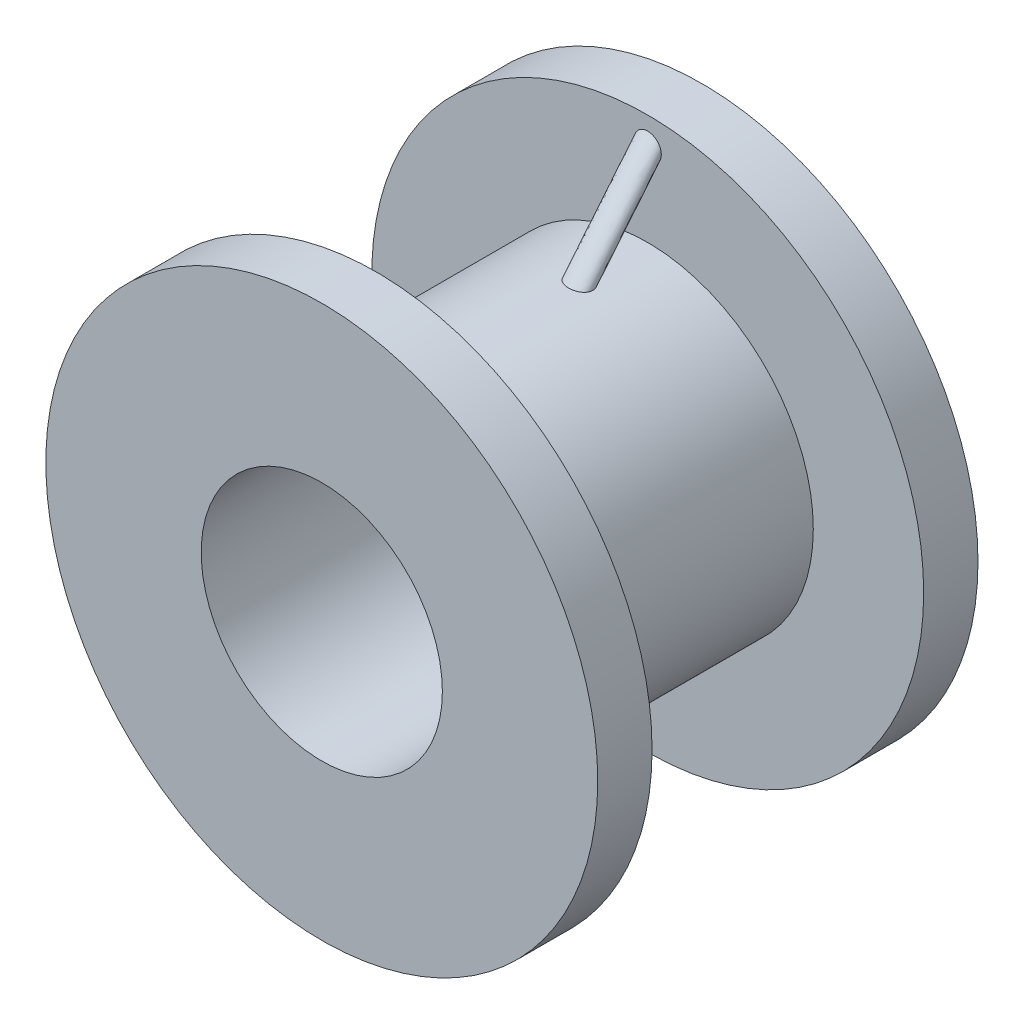
ISO-10303-21;
HEADER;
FILE_DESCRIPTION(('STEP AP214'),'2;1');
FILE_NAME('part.step','',(''),(''),'','','');
FILE_SCHEMA(('AUTOMOTIVE_DESIGN { 1 0 10303 214 1 1 1 1 }'));
ENDSEC;
DATA;
#1=APPLICATION_CONTEXT('core data for automotive mechanical design processes');
#2=APPLICATION_PROTOCOL_DEFINITION('international standard','automotive_design',2000,#1);
#3=PRODUCT_CONTEXT('',#1,'mechanical');
#4=PRODUCT('Part','Part','',(#3));
#5=PRODUCT_RELATED_PRODUCT_CATEGORY('part','',(#4));
#6=PRODUCT_DEFINITION_FORMATION('','',#4);
#7=PRODUCT_DEFINITION_CONTEXT('part definition',#1,'design');
#8=PRODUCT_DEFINITION('design','',#6,#7);
#9=PRODUCT_DEFINITION_SHAPE('','',#8);
#10=(LENGTH_UNIT() NAMED_UNIT(*) SI_UNIT(.MILLI.,.METRE.));
#11=(NAMED_UNIT(*) PLANE_ANGLE_UNIT() SI_UNIT($,.RADIAN.));
#12=(NAMED_UNIT(*) SI_UNIT($,.STERADIAN.) SOLID_ANGLE_UNIT());
#13=UNCERTAINTY_MEASURE_WITH_UNIT(LENGTH_MEASURE(1.E-05),#10,'distance_accuracy_value','');
#14=(GEOMETRIC_REPRESENTATION_CONTEXT(3) GLOBAL_UNCERTAINTY_ASSIGNED_CONTEXT((#13)) GLOBAL_UNIT_ASSIGNED_CONTEXT((#10,
#11,#12)) REPRESENTATION_CONTEXT('',''));
#15=CARTESIAN_POINT('',(0.,0.,0.));
#16=DIRECTION('',(0.,0.,1.));
#17=DIRECTION('',(1.,0.,0.));
#18=AXIS2_PLACEMENT_3D('',#15,#16,#17);
#19=CARTESIAN_POINT('',(0.,0.,5.));
#20=DIRECTION('',(0.,0.,-1.));
#21=DIRECTION('',(-1.,0.,0.));
#22=AXIS2_PLACEMENT_3D('',#19,#20,#21);
#23=CYLINDRICAL_SURFACE('',#22,5.1);
#24=CARTESIAN_POINT('',(0.,0.,5.));
#25=DIRECTION('',(0.,0.,1.));
#26=DIRECTION('',(1.,0.,0.));
#27=AXIS2_PLACEMENT_3D('',#24,#25,#26);
#28=CIRCLE('',#27,5.1);
#29=CARTESIAN_POINT('',(5.1,0.,5.));
#30=VERTEX_POINT('',#29);
#31=EDGE_CURVE('E126',#30,#30,#28,.T.);
#32=ORIENTED_EDGE('',*,*,#31,.T.);
#33=EDGE_LOOP('',(#32));
#34=FACE_BOUND('',#33,.T.);
#35=CARTESIAN_POINT('',(0.,0.,1.2));
#36=DIRECTION('',(0.,0.,-1.));
#37=DIRECTION('',(-1.,0.,0.));
#38=AXIS2_PLACEMENT_3D('',#35,#36,#37);
#39=CIRCLE('',#38,5.1);
#40=CARTESIAN_POINT('',(-5.1,0.,1.2));
#41=VERTEX_POINT('',#40);
#42=EDGE_CURVE('E94',#41,#41,#39,.T.);
#43=ORIENTED_EDGE('',*,*,#42,.T.);
#44=EDGE_LOOP('',(#43));
#45=FACE_BOUND('',#44,.T.);
#46=ADVANCED_FACE('F37',(#34,#45),#23,.F.);
#47=CARTESIAN_POINT('',(0.,8.,5.));
#48=DIRECTION('',(0.,0.,-1.));
#49=DIRECTION('',(-1.,0.,0.));
#50=AXIS2_PLACEMENT_3D('',#47,#48,#49);
#51=CYLINDRICAL_SURFACE('',#50,1.5);
#52=CARTESIAN_POINT('',(0.,8.,5.));
#53=DIRECTION('',(0.,0.,1.));
#54=DIRECTION('',(1.,0.,0.));
#55=AXIS2_PLACEMENT_3D('',#52,#53,#54);
#56=CIRCLE('',#55,1.5);
#57=CARTESIAN_POINT('',(1.5,8.,5.));
#58=VERTEX_POINT('',#57);
#59=EDGE_CURVE('E122',#58,#58,#56,.T.);
#60=ORIENTED_EDGE('',*,*,#59,.T.);
#61=EDGE_LOOP('',(#60));
#62=FACE_BOUND('',#61,.T.);
#63=CARTESIAN_POINT('',(0.,8.,1.2));
#64=DIRECTION('',(0.,0.,-1.));
#65=DIRECTION('',(-1.,0.,0.));
#66=AXIS2_PLACEMENT_3D('',#63,#64,#65);
#67=CIRCLE('',#66,1.5);
#68=CARTESIAN_POINT('',(-1.5,8.,1.2));
#69=VERTEX_POINT('',#68);
#70=EDGE_CURVE('E90',#69,#69,#67,.T.);
#71=ORIENTED_EDGE('',*,*,#70,.T.);
#72=EDGE_LOOP('',(#71));
#73=FACE_BOUND('',#72,.T.);
#74=ADVANCED_FACE('F170',(#62,#73),#51,.F.);
#75=CARTESIAN_POINT('',(8.00000000000023,2.25904099284255E-13,5.));
#76=DIRECTION('',(0.,0.,-1.));
#77=DIRECTION('',(-1.,0.,0.));
#78=AXIS2_PLACEMENT_3D('',#75,#76,#77);
#79=CYLINDRICAL_SURFACE('',#78,1.50000000000018);
#80=CARTESIAN_POINT('',(8.00000000000023,2.25904099284255E-13,5.));
#81=DIRECTION('',(0.,0.,1.));
#82=DIRECTION('',(1.,0.,0.));
#83=AXIS2_PLACEMENT_3D('',#80,#81,#82);
#84=CIRCLE('',#83,1.50000000000018);
#85=CARTESIAN_POINT('',(9.5000000000004,2.25904099284255E-13,5.));
#86=VERTEX_POINT('',#85);
#87=EDGE_CURVE('E118',#86,#86,#84,.T.);
#88=ORIENTED_EDGE('',*,*,#87,.T.);
#89=EDGE_LOOP('',(#88));
#90=FACE_BOUND('',#89,.T.);
#91=CARTESIAN_POINT('',(8.00000000000023,2.25904099284255E-13,1.2));
#92=DIRECTION('',(0.,0.,-1.));
#93=DIRECTION('',(-1.,0.,0.));
#94=AXIS2_PLACEMENT_3D('',#91,#92,#93);
#95=CIRCLE('',#94,1.50000000000018);
#96=CARTESIAN_POINT('',(6.50000000000005,2.25904099284255E-13,1.2));
#97=VERTEX_POINT('',#96);
#98=EDGE_CURVE('E70',#97,#97,#95,.T.);
#99=ORIENTED_EDGE('',*,*,#98,.T.);
#100=EDGE_LOOP('',(#99));
#101=FACE_BOUND('',#100,.T.);
#102=ADVANCED_FACE('F176',(#90,#101),#79,.F.);
#103=CARTESIAN_POINT('',(4.51808198568511E-13,-8.,5.));
#104=DIRECTION('',(0.,0.,-1.));
#105=DIRECTION('',(-1.,0.,0.));
#106=AXIS2_PLACEMENT_3D('',#103,#104,#105);
#107=CYLINDRICAL_SURFACE('',#106,1.50000000000049);
#108=CARTESIAN_POINT('',(4.51808198568511E-13,-8.,5.));
#109=DIRECTION('',(0.,0.,1.));
#110=DIRECTION('',(1.,0.,0.));
#111=AXIS2_PLACEMENT_3D('',#108,#109,#110);
#112=CIRCLE('',#111,1.50000000000049);
#113=CARTESIAN_POINT('',(1.50000000000094,-8.,5.));
#114=VERTEX_POINT('',#113);
#115=EDGE_CURVE('E114',#114,#114,#112,.T.);
#116=ORIENTED_EDGE('',*,*,#115,.T.);
#117=EDGE_LOOP('',(#116));
#118=FACE_BOUND('',#117,.T.);
#119=CARTESIAN_POINT('',(4.51808198568511E-13,-8.,1.2));
#120=DIRECTION('',(0.,0.,-1.));
#121=DIRECTION('',(-1.,0.,0.));
#122=AXIS2_PLACEMENT_3D('',#119,#120,#121);
#123=CIRCLE('',#122,1.50000000000049);
#124=CARTESIAN_POINT('',(-1.50000000000003,-8.,1.2));
#125=VERTEX_POINT('',#124);
#126=EDGE_CURVE('E63',#125,#125,#123,.T.);
#127=ORIENTED_EDGE('',*,*,#126,.T.);
#128=EDGE_LOOP('',(#127));
#129=FACE_BOUND('',#128,.T.);
#130=ADVANCED_FACE('F197',(#118,#129),#107,.F.);
#131=CARTESIAN_POINT('',(-7.99999999999977,-2.26883816723573E-13,5.));
#132=DIRECTION('',(0.,0.,-1.));
#133=DIRECTION('',(-1.,0.,0.));
#134=AXIS2_PLACEMENT_3D('',#131,#132,#133);
#135=CYLINDRICAL_SURFACE('',#134,1.50000000000036);
#136=CARTESIAN_POINT('',(-7.99999999999977,-2.26883816723573E-13,5.));
#137=DIRECTION('',(0.,0.,1.));
#138=DIRECTION('',(1.,0.,0.));
#139=AXIS2_PLACEMENT_3D('',#136,#137,#138);
#140=CIRCLE('',#139,1.50000000000036);
#141=CARTESIAN_POINT('',(-6.49999999999941,-2.26883816723573E-13,5.));
#142=VERTEX_POINT('',#141);
#143=EDGE_CURVE('E107',#142,#142,#140,.T.);
#144=ORIENTED_EDGE('',*,*,#143,.T.);
#145=EDGE_LOOP('',(#144));
#146=FACE_BOUND('',#145,.T.);
#147=CARTESIAN_POINT('',(-7.99999999999977,-2.26883816723573E-13,1.2));
#148=DIRECTION('',(0.,0.,-1.));
#149=DIRECTION('',(-1.,0.,0.));
#150=AXIS2_PLACEMENT_3D('',#147,#148,#149);
#151=CIRCLE('',#150,1.50000000000036);
#152=CARTESIAN_POINT('',(-9.50000000000014,-2.26883816723573E-13,1.2));
#153=VERTEX_POINT('',#152);
#154=EDGE_CURVE('E60',#153,#153,#151,.T.);
#155=ORIENTED_EDGE('',*,*,#154,.T.);
#156=EDGE_LOOP('',(#155));
#157=FACE_BOUND('',#156,.T.);
#158=ADVANCED_FACE('F189',(#146,#157),#135,.F.);
#159=CARTESIAN_POINT('',(0.,0.,30.));
#160=DIRECTION('',(0.,0.,-1.));
#161=DIRECTION('',(-1.,0.,0.));
#162=AXIS2_PLACEMENT_3D('',#159,#160,#161);
#163=CYLINDRICAL_SURFACE('',#162,15.24);
#164=CARTESIAN_POINT('',(1.25,15.1886503679557,11.2921174803513));
#165=CARTESIAN_POINT('',(1.24999756472379,15.1886507077917,11.3346364163182));
#166=CARTESIAN_POINT('',(1.24675799557911,15.1889182935092,11.377195204839));
#167=CARTESIAN_POINT('',(1.23374354330848,15.1899808325462,11.4613292904454));
#168=CARTESIAN_POINT('',(1.22396056094755,15.1907764394244,11.5029033024921));
#169=CARTESIAN_POINT('',(1.19697870191073,15.1929273233436,11.5876925032095));
#170=CARTESIAN_POINT('',(1.1791938823779,15.194326360903,11.6307209599444));
#171=CARTESIAN_POINT('',(1.13697179553278,15.1975438768993,11.7133360144388));
#172=CARTESIAN_POINT('',(1.11253353637515,15.1993624178664,11.752922097873));
#173=CARTESIAN_POINT('',(1.0567508987362,15.2033448047704,11.8297189420316));
#174=CARTESIAN_POINT('',(1.02513678146332,15.2055208301396,11.8667317581816));
#175=CARTESIAN_POINT('',(0.95692017422213,15.2099661825684,11.9358794603069));
#176=CARTESIAN_POINT('',(0.920311146284868,15.2122356291447,11.9680078344005));
#177=CARTESIAN_POINT('',(0.853840556457295,15.2160882812571,12.0191130458619));
#178=CARTESIAN_POINT('',(0.824880116127292,15.2176890744041,12.0392808431025));
#179=CARTESIAN_POINT('',(0.765335216770144,15.220799968136,12.0769889312675));
#180=CARTESIAN_POINT('',(0.734752212380525,15.2223101474519,12.0945315235364));
#181=CARTESIAN_POINT('',(0.640965995105186,15.2266432588282,12.1433522475557));
#182=CARTESIAN_POINT('',(0.575740735381577,15.2292678577013,12.1708119917706));
#183=CARTESIAN_POINT('',(0.42663273633391,15.2342494002924,12.2212453696165));
#184=CARTESIAN_POINT('',(0.341913795460302,15.2364053446868,12.2417276452761));
#185=CARTESIAN_POINT('',(0.169367134842461,15.2393061801908,12.2689749636518));
#186=CARTESIAN_POINT('',(0.0815153457112972,15.2400351427822,12.2755852195895));
#187=CARTESIAN_POINT('',(-0.0944154057573429,15.2399621283855,12.2749146640506));
#188=CARTESIAN_POINT('',(-0.182494210368048,15.2391553141239,12.2675899613379));
#189=CARTESIAN_POINT('',(-0.360453207524847,15.2360087533617,12.2379623068773));
#190=CARTESIAN_POINT('',(-0.450218472683722,15.2335976228445,12.2149605886459));
#191=CARTESIAN_POINT('',(-0.623606754392074,15.2274808175461,12.1522908799842));
#192=CARTESIAN_POINT('',(-0.70724927934526,15.2237794921821,12.1126787953531));
#193=CARTESIAN_POINT('',(-0.83457197403422,15.2172123549019,12.0337275292148));
#194=CARTESIAN_POINT('',(-0.881582127204632,15.2145445851597,11.9997174482004));
#195=CARTESIAN_POINT('',(-0.969578858551064,15.2091896205214,11.9245810840109));
#196=CARTESIAN_POINT('',(-1.01056923678922,15.2065024390133,11.8834593261925));
#197=CARTESIAN_POINT('',(-1.08489253956253,15.2013820684659,11.7940191589873));
#198=CARTESIAN_POINT('',(-1.11814723356446,15.1989515994834,11.7456347382226));
#199=CARTESIAN_POINT('',(-1.17432086150133,15.1947153396508,11.6431648273841));
#200=CARTESIAN_POINT('',(-1.19725214658677,15.1929088029205,11.5890862460692));
#201=CARTESIAN_POINT('',(-1.22869358619139,15.1903957213523,11.4856870028314));
#202=CARTESIAN_POINT('',(-1.23884776158595,15.1895650612168,11.4368645799769));
#203=CARTESIAN_POINT('',(-1.2502197541278,15.1886334189663,11.338189342365));
#204=CARTESIAN_POINT('',(-1.25143937792873,15.1885322893333,11.2883367379648));
#205=CARTESIAN_POINT('',(-1.24538631489078,15.1890295281626,11.1923408513836));
#206=CARTESIAN_POINT('',(-1.23864338244821,15.189584264259,11.1461616173153));
#207=CARTESIAN_POINT('',(-1.21810917998362,15.1912446718733,11.0554241671132));
#208=CARTESIAN_POINT('',(-1.20431681577456,15.192350428918,11.0108662037777));
#209=CARTESIAN_POINT('',(-1.16908161436973,15.1951039140539,10.9207716771474));
#210=CARTESIAN_POINT('',(-1.14711458931958,15.1967879512244,10.8754424730227));
#211=CARTESIAN_POINT('',(-1.0968270683046,15.2005001816707,10.7884074633811));
#212=CARTESIAN_POINT('',(-1.06849536207263,15.2025289806293,10.746708233458));
#213=CARTESIAN_POINT('',(-1.00184647093163,15.2070764941987,10.6616372989043));
#214=CARTESIAN_POINT('',(-0.962670717672425,15.2096231852427,10.618940245359));
#215=CARTESIAN_POINT('',(-0.878574030335852,15.2147127611606,10.5396592261852));
#216=CARTESIAN_POINT('',(-0.833650384082611,15.2172556436605,10.5030781653406));
#217=CARTESIAN_POINT('',(-0.731916659529965,15.2225119495682,10.431229311045));
#218=CARTESIAN_POINT('',(-0.674342633049696,15.2251909709145,10.397038670294));
#219=CARTESIAN_POINT('',(-0.554766901187275,15.2300169539856,10.3377063179949));
#220=CARTESIAN_POINT('',(-0.492767808153596,15.232164226337,10.3125593196077));
#221=CARTESIAN_POINT('',(-0.358614009392797,15.2359436505221,10.2692291392045));
#222=CARTESIAN_POINT('',(-0.28610040939047,15.2374909559115,10.2521440997484));
#223=CARTESIAN_POINT('',(-0.139265366693991,15.2395407886752,10.2296646497773));
#224=CARTESIAN_POINT('',(-0.0649433500739028,15.2400429798749,10.2242740008921));
#225=CARTESIAN_POINT('',(0.0875818393502553,15.2399488532047,10.2252893527536));
#226=CARTESIAN_POINT('',(0.165781794712161,15.2392928610306,10.2323361764616));
#227=CARTESIAN_POINT('',(0.319894358972409,15.2368374490321,10.2593794387142));
#228=CARTESIAN_POINT('',(0.395806664945443,15.2350378784684,10.2793775844264));
#229=CARTESIAN_POINT('',(0.543146254233302,15.2304962119241,10.3320825104804));
#230=CARTESIAN_POINT('',(0.614572934043815,15.2277539894374,10.3647909966574));
#231=CARTESIAN_POINT('',(0.716389029199288,15.2231913040929,10.4229489439116));
#232=CARTESIAN_POINT('',(0.749445462539723,15.2215952141396,10.4438550306284));
#233=CARTESIAN_POINT('',(0.813546741992054,15.2183038554549,10.4886689487314));
#234=CARTESIAN_POINT('',(0.844587655004572,15.2166084044053,10.5125823966799));
#235=CARTESIAN_POINT('',(0.930482422527918,15.2116712821426,10.5856007633928));
#236=CARTESIAN_POINT('',(0.982298411856621,15.2083798036215,10.6383801649181));
#237=CARTESIAN_POINT('',(1.07453436698277,15.2021420409074,10.7530309868387));
#238=CARTESIAN_POINT('',(1.11498216924754,15.1991949240352,10.8148796242403));
#239=CARTESIAN_POINT('',(1.17164903931947,15.194913300758,10.9264131040266));
#240=CARTESIAN_POINT('',(1.19149612470082,15.1933597750392,10.9742614733748));
#241=CARTESIAN_POINT('',(1.22297466232676,15.1908586744446,11.0725333114954));
#242=CARTESIAN_POINT('',(1.23463077395779,15.1899092816152,11.1229485567446));
#243=CARTESIAN_POINT('',(1.24447845152581,15.1891039410812,11.1935147007421));
#244=CARTESIAN_POINT('',(1.24654103911312,15.1889346973406,11.2131724989667));
#245=CARTESIAN_POINT('',(1.2493025389242,15.1887078187275,11.2525898049872));
#246=CARTESIAN_POINT('',(1.25000113222243,15.1886502099572,11.2723493354873));
#247=CARTESIAN_POINT('',(1.25,15.1886503679557,11.2921174803513));
#248=B_SPLINE_CURVE_WITH_KNOTS('',3,(#164,#165,#166,#167,#168,#169,#170,#171,#172,#173,#174,
#175,#176,#177,#178,#179,#180,#181,#182,#183,#184,#185,#186,#187,#188,#189,#190,#191,#192,#193,
#194,#195,#196,#197,#198,#199,#200,#201,#202,#203,#204,#205,#206,#207,#208,#209,#210,#211,#212,
#213,#214,#215,#216,#217,#218,#219,#220,#221,#222,#223,#224,#225,#226,#227,#228,#229,#230,#231,
#232,#233,#234,#235,#236,#237,#238,#239,#240,#241,#242,#243,#244,#245,#246,#247),.UNSPECIFIED.,
.T.,.F.,(4,2,2,2,2,2,2,2,2,2,2,2,2,2,2,2,2,2,2,2,2,2,2,2,2,2,2,2,2,2,2,2,2,2,2,2,2,2,2,2,2,4),
(0.,0.127494200250433,0.255146501645715,0.394236856677983,0.533347957630776,0.678971206938459,
0.82478692837045,0.930633071077237,1.03638587492518,1.24794760340974,1.5082541494728,
1.7714501325736,2.03547648237413,2.31211482171943,2.58782945459713,2.76146152477197,
2.93498351187648,3.11019064208728,3.28518758993729,3.43400903167589,3.58280037943381,
3.7222253752333,3.86167201864644,4.01228518380844,4.16316573692619,4.33650060882215,
4.50991757348729,4.71014194034891,4.9102490666898,5.13281187632766,5.35544626514202,
5.58988852434376,5.82436169264611,6.05886634010828,6.17615769231945,6.29367144530172,
6.5144261145259,6.73463543226027,6.88950074477465,7.04389780570257,7.10315927768845,
7.16243460437659),.UNSPECIFIED.);
#249=CARTESIAN_POINT('',(1.25,15.1886503679557,11.2921174803513));
#250=VERTEX_POINT('',#249);
#251=EDGE_CURVE('E79',#250,#250,#248,.T.);
#252=ORIENTED_EDGE('',*,*,#251,.T.);
#253=EDGE_LOOP('',(#252));
#254=FACE_BOUND('',#253,.T.);
#255=CARTESIAN_POINT('',(0.,0.,5.));
#256=DIRECTION('',(0.,0.,1.));
#257=DIRECTION('',(1.,0.,0.));
#258=AXIS2_PLACEMENT_3D('',#255,#256,#257);
#259=CIRCLE('',#258,15.24);
#260=CARTESIAN_POINT('',(15.24,0.,5.));
#261=VERTEX_POINT('',#260);
#262=EDGE_CURVE('E57',#261,#261,#259,.T.);
#263=ORIENTED_EDGE('',*,*,#262,.T.);
#264=EDGE_LOOP('',(#263));
#265=FACE_BOUND('',#264,.T.);
#266=CARTESIAN_POINT('',(0.,0.,30.));
#267=DIRECTION('',(0.,0.,1.));
#268=DIRECTION('',(1.,0.,0.));
#269=AXIS2_PLACEMENT_3D('',#266,#267,#268);
#270=CIRCLE('',#269,15.24);
#271=CARTESIAN_POINT('',(15.24,0.,30.));
#272=VERTEX_POINT('',#271);
#273=EDGE_CURVE('E51',#272,#272,#270,.T.);
#274=ORIENTED_EDGE('',*,*,#273,.F.);
#275=EDGE_LOOP('',(#274));
#276=FACE_BOUND('',#275,.T.);
#277=ADVANCED_FACE('F39',(#254,#265,#276),#163,.T.);
#278=CARTESIAN_POINT('',(0.,0.,30.));
#279=DIRECTION('',(0.,0.,-1.));
#280=DIRECTION('',(-1.,0.,0.));
#281=AXIS2_PLACEMENT_3D('',#278,#279,#280);
#282=CYLINDRICAL_SURFACE('',#281,11.1);
#283=CARTESIAN_POINT('',(0.,0.,5.));
#284=DIRECTION('',(0.,0.,1.));
#285=DIRECTION('',(1.,0.,0.));
#286=AXIS2_PLACEMENT_3D('',#283,#284,#285);
#287=CIRCLE('',#286,11.1);
#288=CARTESIAN_POINT('',(11.1,0.,5.));
#289=VERTEX_POINT('',#288);
#290=EDGE_CURVE('E46',#289,#289,#287,.T.);
#291=ORIENTED_EDGE('',*,*,#290,.F.);
#292=EDGE_LOOP('',(#291));
#293=FACE_BOUND('',#292,.T.);
#294=CARTESIAN_POINT('',(0.,0.,35.));
#295=DIRECTION('',(0.,0.,1.));
#296=DIRECTION('',(1.,0.,0.));
#297=AXIS2_PLACEMENT_3D('',#294,#295,#296);
#298=CIRCLE('',#297,11.1);
#299=CARTESIAN_POINT('',(11.1,0.,35.));
#300=VERTEX_POINT('',#299);
#301=EDGE_CURVE('E98',#300,#300,#298,.T.);
#302=ORIENTED_EDGE('',*,*,#301,.T.);
#303=EDGE_LOOP('',(#302));
#304=FACE_BOUND('',#303,.T.);
#305=ADVANCED_FACE('F181',(#293,#304),#282,.F.);
#306=CARTESIAN_POINT('',(0.,0.,5.));
#307=DIRECTION('',(0.,0.,1.));
#308=DIRECTION('',(1.,0.,0.));
#309=AXIS2_PLACEMENT_3D('',#306,#307,#308);
#310=PLANE('',#309);
#311=ORIENTED_EDGE('',*,*,#143,.F.);
#312=EDGE_LOOP('',(#311));
#313=FACE_BOUND('',#312,.T.);
#314=ORIENTED_EDGE('',*,*,#87,.F.);
#315=EDGE_LOOP('',(#314));
#316=FACE_BOUND('',#315,.T.);
#317=ORIENTED_EDGE('',*,*,#31,.F.);
#318=EDGE_LOOP('',(#317));
#319=FACE_BOUND('',#318,.T.);
#320=ORIENTED_EDGE('',*,*,#59,.F.);
#321=EDGE_LOOP('',(#320));
#322=FACE_BOUND('',#321,.T.);
#323=ORIENTED_EDGE('',*,*,#115,.F.);
#324=EDGE_LOOP('',(#323));
#325=FACE_BOUND('',#324,.T.);
#326=ORIENTED_EDGE('',*,*,#290,.T.);
#327=EDGE_LOOP('',(#326));
#328=FACE_BOUND('',#327,.T.);
#329=ADVANCED_FACE('F147',(#313,#316,#319,#322,#325,#328),#310,.T.);
#330=CARTESIAN_POINT('',(0.,22.86,5.));
#331=DIRECTION('',(0.,0.,1.));
#332=DIRECTION('',(1.,0.,0.));
#333=AXIS2_PLACEMENT_3D('',#330,#331,#332);
#334=CIRCLE('',#333,1.25);
#335=CARTESIAN_POINT('',(1.25,22.86,5.));
#336=VERTEX_POINT('',#335);
#337=EDGE_CURVE('E10',#336,#336,#334,.T.);
#338=ORIENTED_EDGE('',*,*,#337,.F.);
#339=EDGE_LOOP('',(#338));
#340=FACE_BOUND('',#339,.T.);
#341=ORIENTED_EDGE('',*,*,#262,.F.);
#342=EDGE_LOOP('',(#341));
#343=FACE_BOUND('',#342,.T.);
#344=CARTESIAN_POINT('',(0.,0.,5.));
#345=DIRECTION('',(0.,0.,1.));
#346=DIRECTION('',(1.,0.,0.));
#347=AXIS2_PLACEMENT_3D('',#344,#345,#346);
#348=CIRCLE('',#347,25.4);
#349=CARTESIAN_POINT('',(25.4,0.,5.));
#350=VERTEX_POINT('',#349);
#351=EDGE_CURVE('E131',#350,#350,#348,.T.);
#352=ORIENTED_EDGE('',*,*,#351,.T.);
#353=EDGE_LOOP('',(#352));
#354=FACE_BOUND('',#353,.T.);
#355=ADVANCED_FACE('F143',(#340,#343,#354),#310,.T.);
#356=CARTESIAN_POINT('',(0.,0.,5.));
#357=DIRECTION('',(0.,0.,-1.));
#358=DIRECTION('',(-1.,0.,0.));
#359=AXIS2_PLACEMENT_3D('',#356,#357,#358);
#360=CYLINDRICAL_SURFACE('',#359,25.4);
#361=ORIENTED_EDGE('',*,*,#351,.F.);
#362=EDGE_LOOP('',(#361));
#363=FACE_BOUND('',#362,.T.);
#364=CARTESIAN_POINT('',(0.,0.,0.));
#365=DIRECTION('',(0.,0.,1.));
#366=DIRECTION('',(1.,0.,0.));
#367=AXIS2_PLACEMENT_3D('',#364,#365,#366);
#368=CIRCLE('',#367,25.4);
#369=CARTESIAN_POINT('',(25.4,0.,0.));
#370=VERTEX_POINT('',#369);
#371=EDGE_CURVE('E130',#370,#370,#368,.T.);
#372=ORIENTED_EDGE('',*,*,#371,.T.);
#373=EDGE_LOOP('',(#372));
#374=FACE_BOUND('',#373,.T.);
#375=ADVANCED_FACE('F146',(#363,#374),#360,.T.);
#376=CARTESIAN_POINT('',(0.,0.,0.));
#377=DIRECTION('',(0.,0.,1.));
#378=DIRECTION('',(1.,0.,0.));
#379=AXIS2_PLACEMENT_3D('',#376,#377,#378);
#380=PLANE('',#379);
#381=CARTESIAN_POINT('',(0.,0.,0.));
#382=DIRECTION('',(0.,0.,-1.));
#383=DIRECTION('',(-1.,0.,0.));
#384=AXIS2_PLACEMENT_3D('',#381,#382,#383);
#385=CIRCLE('',#384,11.1);
#386=CARTESIAN_POINT('',(-11.1,0.,0.));
#387=VERTEX_POINT('',#386);
#388=EDGE_CURVE('E73',#387,#387,#385,.T.);
#389=ORIENTED_EDGE('',*,*,#388,.F.);
#390=EDGE_LOOP('',(#389));
#391=FACE_BOUND('',#390,.T.);
#392=ORIENTED_EDGE('',*,*,#371,.F.);
#393=EDGE_LOOP('',(#392));
#394=FACE_BOUND('',#393,.T.);
#395=ADVANCED_FACE('F154',(#391,#394),#380,.F.);
#396=CARTESIAN_POINT('',(0.,0.,35.));
#397=DIRECTION('',(0.,0.,1.));
#398=DIRECTION('',(1.,0.,0.));
#399=AXIS2_PLACEMENT_3D('',#396,#397,#398);
#400=PLANE('',#399);
#401=CARTESIAN_POINT('',(0.,0.,35.));
#402=DIRECTION('',(0.,0.,1.));
#403=DIRECTION('',(1.,0.,0.));
#404=AXIS2_PLACEMENT_3D('',#401,#402,#403);
#405=CIRCLE('',#404,25.4);
#406=CARTESIAN_POINT('',(25.4,0.,35.));
#407=VERTEX_POINT('',#406);
#408=EDGE_CURVE('E103',#407,#407,#405,.T.);
#409=ORIENTED_EDGE('',*,*,#408,.T.);
#410=EDGE_LOOP('',(#409));
#411=FACE_BOUND('',#410,.T.);
#412=ORIENTED_EDGE('',*,*,#301,.F.);
#413=EDGE_LOOP('',(#412));
#414=FACE_BOUND('',#413,.T.);
#415=ADVANCED_FACE('F159',(#411,#414),#400,.T.);
#416=CARTESIAN_POINT('',(0.,0.,30.));
#417=DIRECTION('',(0.,0.,1.));
#418=DIRECTION('',(1.,0.,0.));
#419=AXIS2_PLACEMENT_3D('',#416,#417,#418);
#420=PLANE('',#419);
#421=ORIENTED_EDGE('',*,*,#273,.T.);
#422=EDGE_LOOP('',(#421));
#423=FACE_BOUND('',#422,.T.);
#424=CARTESIAN_POINT('',(0.,0.,30.));
#425=DIRECTION('',(0.,0.,1.));
#426=DIRECTION('',(1.,0.,0.));
#427=AXIS2_PLACEMENT_3D('',#424,#425,#426);
#428=CIRCLE('',#427,25.4);
#429=CARTESIAN_POINT('',(25.4,0.,30.));
#430=VERTEX_POINT('',#429);
#431=EDGE_CURVE('E102',#430,#430,#428,.T.);
#432=ORIENTED_EDGE('',*,*,#431,.F.);
#433=EDGE_LOOP('',(#432));
#434=FACE_BOUND('',#433,.T.);
#435=ADVANCED_FACE('F164',(#423,#434),#420,.F.);
#436=CARTESIAN_POINT('',(0.,0.,35.));
#437=DIRECTION('',(0.,0.,-1.));
#438=DIRECTION('',(-1.,0.,0.));
#439=AXIS2_PLACEMENT_3D('',#436,#437,#438);
#440=CYLINDRICAL_SURFACE('',#439,25.4);
#441=ORIENTED_EDGE('',*,*,#408,.F.);
#442=EDGE_LOOP('',(#441));
#443=FACE_BOUND('',#442,.T.);
#444=ORIENTED_EDGE('',*,*,#431,.T.);
#445=EDGE_LOOP('',(#444));
#446=FACE_BOUND('',#445,.T.);
#447=ADVANCED_FACE('F223',(#443,#446),#440,.T.);
#448=CARTESIAN_POINT('',(0.,0.,1.2));
#449=DIRECTION('',(0.,0.,-1.));
#450=DIRECTION('',(-1.,0.,0.));
#451=AXIS2_PLACEMENT_3D('',#448,#449,#450);
#452=CYLINDRICAL_SURFACE('',#451,11.1);
#453=CARTESIAN_POINT('',(0.,0.,1.2));
#454=DIRECTION('',(0.,0.,-1.));
#455=DIRECTION('',(-1.,0.,0.));
#456=AXIS2_PLACEMENT_3D('',#453,#454,#455);
#457=CIRCLE('',#456,11.1);
#458=CARTESIAN_POINT('',(-11.1,0.,1.2));
#459=VERTEX_POINT('',#458);
#460=EDGE_CURVE('E64',#459,#459,#457,.T.);
#461=ORIENTED_EDGE('',*,*,#460,.F.);
#462=EDGE_LOOP('',(#461));
#463=FACE_BOUND('',#462,.T.);
#464=ORIENTED_EDGE('',*,*,#388,.T.);
#465=EDGE_LOOP('',(#464));
#466=FACE_BOUND('',#465,.T.);
#467=ADVANCED_FACE('F210',(#463,#466),#452,.F.);
#468=CARTESIAN_POINT('',(0.,0.,1.2));
#469=DIRECTION('',(0.,0.,-1.));
#470=DIRECTION('',(-1.,0.,0.));
#471=AXIS2_PLACEMENT_3D('',#468,#469,#470);
#472=PLANE('',#471);
#473=ORIENTED_EDGE('',*,*,#42,.F.);
#474=EDGE_LOOP('',(#473));
#475=FACE_BOUND('',#474,.T.);
#476=ORIENTED_EDGE('',*,*,#70,.F.);
#477=EDGE_LOOP('',(#476));
#478=FACE_BOUND('',#477,.T.);
#479=ORIENTED_EDGE('',*,*,#98,.F.);
#480=EDGE_LOOP('',(#479));
#481=FACE_BOUND('',#480,.T.);
#482=ORIENTED_EDGE('',*,*,#126,.F.);
#483=EDGE_LOOP('',(#482));
#484=FACE_BOUND('',#483,.T.);
#485=ORIENTED_EDGE('',*,*,#154,.F.);
#486=EDGE_LOOP('',(#485));
#487=FACE_BOUND('',#486,.T.);
#488=ORIENTED_EDGE('',*,*,#460,.T.);
#489=EDGE_LOOP('',(#488));
#490=FACE_BOUND('',#489,.T.);
#491=ADVANCED_FACE('F206',(#475,#478,#481,#484,#487,#490),#472,.T.);
#492=CARTESIAN_POINT('',(1.25,22.86,5.));
#493=CARTESIAN_POINT('',(1.25,13.1206385212308,12.988321422875));
#494=CARTESIAN_POINT('',(1.25,25.36,5.));
#495=CARTESIAN_POINT('',(1.25,15.6206385212308,12.988321422875));
#496=CARTESIAN_POINT('',(-1.25,25.36,5.));
#497=CARTESIAN_POINT('',(-1.25,15.6206385212308,12.988321422875));
#498=CARTESIAN_POINT('',(-1.25,22.86,5.));
#499=CARTESIAN_POINT('',(-1.25,13.1206385212308,12.988321422875));
#500=CARTESIAN_POINT('',(-1.25,20.36,5.));
#501=CARTESIAN_POINT('',(-1.25,10.6206385212308,12.988321422875));
#502=CARTESIAN_POINT('',(1.25,20.36,5.));
#503=CARTESIAN_POINT('',(1.25,10.6206385212308,12.988321422875));
#504=CARTESIAN_POINT('',(1.25,22.86,5.));
#505=CARTESIAN_POINT('',(1.25,13.1206385212308,12.988321422875));
#506=(BOUNDED_SURFACE() B_SPLINE_SURFACE(3,1,((#492,#493),(#494,#495),(#496,#497),(#498,#499),
(#500,#501),(#502,#503),(#504,#505)),.UNSPECIFIED.,.T.,.F.,.F.) B_SPLINE_SURFACE_WITH_KNOTS((4,
3,4),(2,2),(0.,0.5,1.),(0.,1.),
.UNSPECIFIED.) GEOMETRIC_REPRESENTATION_ITEM() RATIONAL_B_SPLINE_SURFACE(((1.,1.),
(0.333333333333333,0.333333333333333),(0.333333333333333,0.333333333333333),(1.,1.),
(0.333333333333333,0.333333333333333),(0.333333333333333,0.333333333333333),(1.,1.))) REPRESENTATION_ITEM('') SURFACE());
#507=CARTESIAN_POINT('',(1.25,22.86,5.));
#508=CARTESIAN_POINT('',(1.25,22.7800901079995,5.06554289042033));
#509=CARTESIAN_POINT('',(1.25,22.7001802159991,5.13108578084065));
#510=CARTESIAN_POINT('',(1.25,22.5403604319982,5.26217156168131));
#511=CARTESIAN_POINT('',(1.25,22.4604505399977,5.32771445210163));
#512=CARTESIAN_POINT('',(1.25,22.3006307559968,5.45880023294228));
#513=CARTESIAN_POINT('',(1.25,22.2207208639963,5.52434312336261));
#514=CARTESIAN_POINT('',(1.25,22.0609010799954,5.65542890420326));
#515=CARTESIAN_POINT('',(1.25,21.9809911879949,5.72097179462359));
#516=CARTESIAN_POINT('',(1.25,21.821171403994,5.85205757546424));
#517=CARTESIAN_POINT('',(1.25,21.7412615119935,5.91760046588457));
#518=CARTESIAN_POINT('',(1.25,21.5814417279926,6.04868624672522));
#519=CARTESIAN_POINT('',(1.25,21.5015318359921,6.11422913714555));
#520=CARTESIAN_POINT('',(1.25,21.3417120519912,6.2453149179862));
#521=CARTESIAN_POINT('',(1.25,21.2618021599908,6.31085780840652));
#522=CARTESIAN_POINT('',(1.25,21.1019823759898,6.44194358924718));
#523=CARTESIAN_POINT('',(1.25,21.0220724839894,6.5074864796675));
#524=CARTESIAN_POINT('',(1.25,20.8622526999885,6.63857226050816));
#525=CARTESIAN_POINT('',(1.25,20.782342807988,6.70411515092848));
#526=CARTESIAN_POINT('',(1.25,20.6225230239871,6.83520093176913));
#527=CARTESIAN_POINT('',(1.25,20.5426131319866,6.90074382218946));
#528=CARTESIAN_POINT('',(1.25,20.3827933479857,7.03182960303011));
#529=CARTESIAN_POINT('',(1.25,20.3028834559852,7.09737249345044));
#530=CARTESIAN_POINT('',(1.25,20.1430636719843,7.22845827429109));
#531=CARTESIAN_POINT('',(1.25,20.0631537799838,7.29400116471142));
#532=CARTESIAN_POINT('',(1.25,19.9033339959829,7.42508694555207));
#533=CARTESIAN_POINT('',(1.25,19.8234241039825,7.49062983597239));
#534=CARTESIAN_POINT('',(1.25,19.6636043199815,7.62171561681305));
#535=CARTESIAN_POINT('',(1.25,19.5836944279811,7.68725850723337));
#536=CARTESIAN_POINT('',(1.25,19.4238746439801,7.81834428807403));
#537=CARTESIAN_POINT('',(1.25,19.3439647519797,7.88388717849435));
#538=CARTESIAN_POINT('',(1.25,19.1841449679788,8.014972959335));
#539=CARTESIAN_POINT('',(1.25,19.1042350759783,8.08051584975533));
#540=CARTESIAN_POINT('',(1.25,18.9444152919774,8.21160163059598));
#541=CARTESIAN_POINT('',(1.25,18.8645053999769,8.27714452101631));
#542=CARTESIAN_POINT('',(1.25,18.704685615976,8.40823030185696));
#543=CARTESIAN_POINT('',(1.25,18.6247757239755,8.47377319227729));
#544=CARTESIAN_POINT('',(1.25,18.4649559399746,8.60485897311794));
#545=CARTESIAN_POINT('',(1.25,18.3850460479741,8.67040186353827));
#546=CARTESIAN_POINT('',(1.25,18.2252262639732,8.80148764437892));
#547=CARTESIAN_POINT('',(1.25,18.1453163719728,8.86703053479924));
#548=CARTESIAN_POINT('',(1.25,17.9854965879718,8.9981163156399));
#549=CARTESIAN_POINT('',(1.25,17.9055866959714,9.06365920606022));
#550=CARTESIAN_POINT('',(1.25,17.7457669119704,9.19474498690087));
#551=CARTESIAN_POINT('',(1.25,17.66585701997,9.2602878773212));
#552=CARTESIAN_POINT('',(1.25,17.5060372359691,9.39137365816186));
#553=CARTESIAN_POINT('',(1.25,17.4261273439686,9.45691654858218));
#554=CARTESIAN_POINT('',(1.25,17.2663075599677,9.58800232942283));
#555=CARTESIAN_POINT('',(1.25,17.1863976679672,9.65354521984316));
#556=CARTESIAN_POINT('',(1.25,17.0265778839663,9.78463100068381));
#557=CARTESIAN_POINT('',(1.25,16.9466679919658,9.85017389110414));
#558=CARTESIAN_POINT('',(1.25,16.7868482079649,9.98125967194479));
#559=CARTESIAN_POINT('',(1.25,16.7069383159644,10.0468025623651));
#560=CARTESIAN_POINT('',(1.25,16.5471185319635,10.1778883432058));
#561=CARTESIAN_POINT('',(1.25,16.4672086399631,10.2434312336261));
#562=CARTESIAN_POINT('',(1.25,16.3073888559621,10.3745170144667));
#563=CARTESIAN_POINT('',(1.25,16.2274789639617,10.4400599048871));
#564=CARTESIAN_POINT('',(1.25,16.0676591799607,10.5711456857277));
#565=CARTESIAN_POINT('',(1.25,15.9877492879603,10.6366885761481));
#566=CARTESIAN_POINT('',(1.25,15.8279295039594,10.7677743569887));
#567=CARTESIAN_POINT('',(1.25,15.7480196119589,10.833317247409));
#568=CARTESIAN_POINT('',(1.25,15.588199827958,10.9644030282497));
#569=CARTESIAN_POINT('',(1.25,15.5082899359575,11.02994591867));
#570=CARTESIAN_POINT('',(1.25,15.3484701519566,11.1610316995107));
#571=CARTESIAN_POINT('',(1.25,15.2685602599561,11.226574589931));
#572=CARTESIAN_POINT('',(1.25,15.1886503679557,11.2921174803513));
#573=B_SPLINE_CURVE_WITH_KNOTS('',3,(#507,#508,#509,#510,#511,#512,#513,#514,#515,#516,#517,
#518,#519,#520,#521,#522,#523,#524,#525,#526,#527,#528,#529,#530,#531,#532,#533,#534,#535,#536,
#537,#538,#539,#540,#541,#542,#543,#544,#545,#546,#547,#548,#549,#550,#551,#552,#553,#554,#555,
#556,#557,#558,#559,#560,#561,#562,#563,#564,#565,#566,#567,#568,#569,#570,#571,#572),
.UNSPECIFIED.,.F.,.F.,(4,2,2,2,2,2,2,2,2,2,2,2,2,2,2,2,2,2,2,2,2,2,2,2,2,2,2,2,2,2,2,2,4),(0.,
0.310053466224113,0.620106932448224,0.930160398672339,1.24021386489645,1.55026733112057,
1.86032079734468,2.17037426356879,2.4804277297929,2.79048119601702,3.10053466224113,
3.41058812846524,3.72064159468935,4.03069506091347,4.34074852713758,4.65080199336169,
4.96085545958581,5.27090892580992,5.58096239203403,5.89101585825814,6.20106932448225,
6.51112279070637,6.82117625693048,7.13122972315459,7.44128318937871,7.75133665560282,
8.06139012182693,8.37144358805105,8.68149705427516,8.99155052049927,9.30160398672338,
9.6116574529475,9.92171091917161),.UNSPECIFIED.);
#574=EDGE_CURVE('BSEAM204',#336,#250,#573,.T.);
#575=ORIENTED_EDGE('',*,*,#337,.T.);
#576=ORIENTED_EDGE('',*,*,#251,.F.);
#577=ORIENTED_EDGE('',*,*,#574,.T.);
#578=ORIENTED_EDGE('',*,*,#574,.F.);
#579=EDGE_LOOP('',(#575,#577,#576,#578));
#580=FACE_BOUND('',#579,.T.);
#581=ADVANCED_FACE('F204',(#580),#506,.T.);
#582=CLOSED_SHELL('',(#46,#74,#102,#130,#158,#277,#305,#329,#355,#375,#395,#415,#435,#447,#467,
#491,#581));
#583=MANIFOLD_SOLID_BREP('B2',#582);
#584=ADVANCED_BREP_SHAPE_REPRESENTATION('',(#18,#583),#14);
#585=SHAPE_DEFINITION_REPRESENTATION(#9,#584);
ENDSEC;
END-ISO-10303-21;
